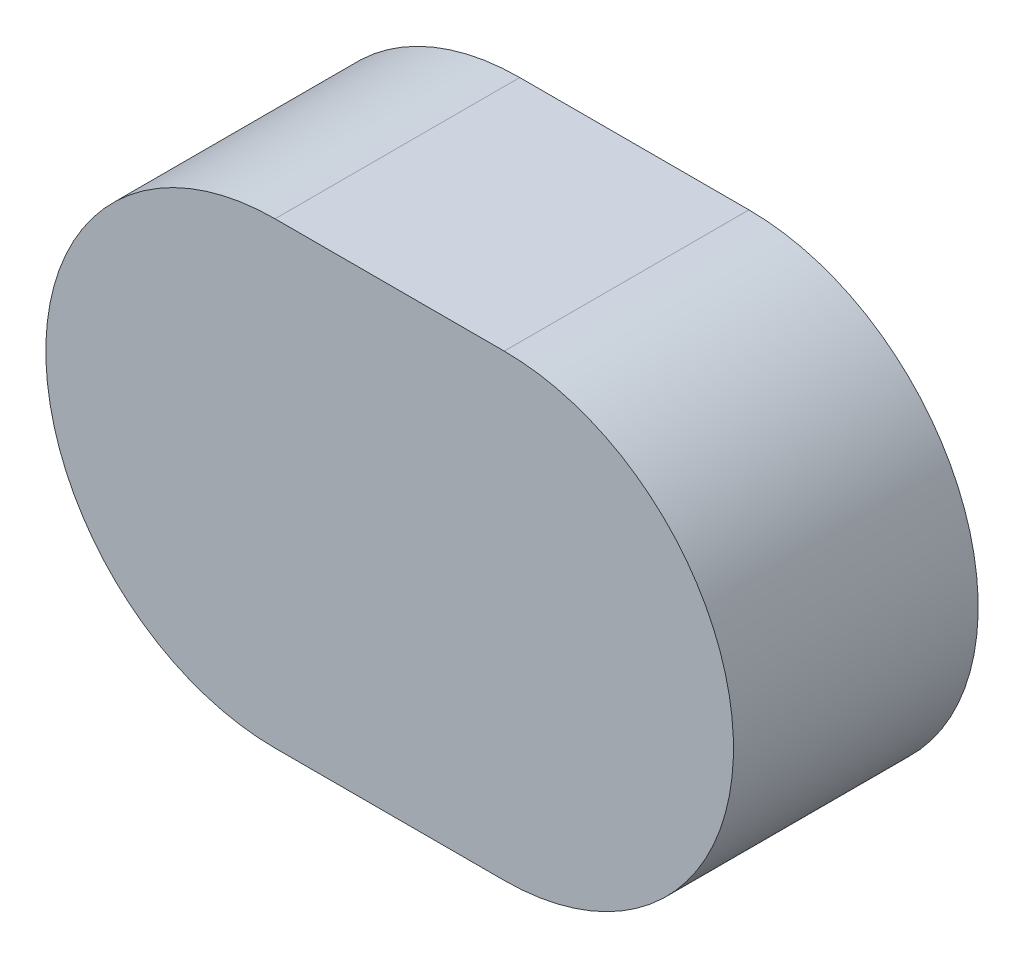
ISO-10303-21;
HEADER;
FILE_DESCRIPTION(('STEP AP214'),'2;1');
FILE_NAME('part.step','',(''),(''),'','','');
FILE_SCHEMA(('AUTOMOTIVE_DESIGN { 1 0 10303 214 1 1 1 1 }'));
ENDSEC;
DATA;
#1=APPLICATION_CONTEXT('core data for automotive mechanical design processes');
#2=APPLICATION_PROTOCOL_DEFINITION('international standard','automotive_design',2000,#1);
#3=PRODUCT_CONTEXT('',#1,'mechanical');
#4=PRODUCT('Part','Part','',(#3));
#5=PRODUCT_RELATED_PRODUCT_CATEGORY('part','',(#4));
#6=PRODUCT_DEFINITION_FORMATION('','',#4);
#7=PRODUCT_DEFINITION_CONTEXT('part definition',#1,'design');
#8=PRODUCT_DEFINITION('design','',#6,#7);
#9=PRODUCT_DEFINITION_SHAPE('','',#8);
#10=(LENGTH_UNIT() NAMED_UNIT(*) SI_UNIT(.MILLI.,.METRE.));
#11=(NAMED_UNIT(*) PLANE_ANGLE_UNIT() SI_UNIT($,.RADIAN.));
#12=(NAMED_UNIT(*) SI_UNIT($,.STERADIAN.) SOLID_ANGLE_UNIT());
#13=UNCERTAINTY_MEASURE_WITH_UNIT(LENGTH_MEASURE(1.E-05),#10,'distance_accuracy_value','');
#14=(GEOMETRIC_REPRESENTATION_CONTEXT(3) GLOBAL_UNCERTAINTY_ASSIGNED_CONTEXT((#13)) GLOBAL_UNIT_ASSIGNED_CONTEXT((#10,
#11,#12)) REPRESENTATION_CONTEXT('',''));
#15=CARTESIAN_POINT('',(0.,0.,0.));
#16=DIRECTION('',(0.,0.,1.));
#17=DIRECTION('',(1.,0.,0.));
#18=AXIS2_PLACEMENT_3D('',#15,#16,#17);
#19=CARTESIAN_POINT('',(-17.8759687907011,0.,4.27));
#20=DIRECTION('',(0.,0.,-1.));
#21=DIRECTION('',(-1.,0.,0.));
#22=AXIS2_PLACEMENT_3D('',#19,#20,#21);
#23=CYLINDRICAL_SURFACE('',#22,4.);
#24=CARTESIAN_POINT('',(-17.8759687907011,0.,0.));
#25=DIRECTION('',(0.,0.,1.));
#26=DIRECTION('',(1.,0.,0.));
#27=AXIS2_PLACEMENT_3D('',#24,#25,#26);
#28=CIRCLE('',#27,4.);
#29=CARTESIAN_POINT('',(-17.8759687907011,4.,0.));
#30=VERTEX_POINT('',#29);
#31=CARTESIAN_POINT('',(-17.8759687907011,-4.,0.));
#32=VERTEX_POINT('',#31);
#33=EDGE_CURVE('E99',#30,#32,#28,.T.);
#34=ORIENTED_EDGE('',*,*,#33,.T.);
#35=DIRECTION('',(0.,0.,-1.));
#36=VECTOR('',#35,1.);
#37=CARTESIAN_POINT('',(-17.8759687907011,-4.,4.27));
#38=LINE('',#37,#36);
#39=CARTESIAN_POINT('',(-17.8759687907011,-4.,4.27));
#40=VERTEX_POINT('',#39);
#41=EDGE_CURVE('E11',#40,#32,#38,.T.);
#42=ORIENTED_EDGE('',*,*,#41,.F.);
#43=CARTESIAN_POINT('',(-17.8759687907011,0.,4.27));
#44=DIRECTION('',(0.,0.,1.));
#45=DIRECTION('',(1.,0.,0.));
#46=AXIS2_PLACEMENT_3D('',#43,#44,#45);
#47=CIRCLE('',#46,4.);
#48=CARTESIAN_POINT('',(-17.8759687907011,4.,4.27));
#49=VERTEX_POINT('',#48);
#50=EDGE_CURVE('E87',#49,#40,#47,.T.);
#51=ORIENTED_EDGE('',*,*,#50,.F.);
#52=DIRECTION('',(0.,0.,-1.));
#53=VECTOR('',#52,1.);
#54=CARTESIAN_POINT('',(-17.8759687907011,4.,4.27));
#55=LINE('',#54,#53);
#56=EDGE_CURVE('E95',#49,#30,#55,.T.);
#57=ORIENTED_EDGE('',*,*,#56,.T.);
#58=EDGE_LOOP('',(#34,#42,#51,#57));
#59=FACE_BOUND('',#58,.T.);
#60=ADVANCED_FACE('F36',(#59),#23,.T.);
#61=CARTESIAN_POINT('',(-17.8759687907011,-4.,4.27));
#62=DIRECTION('',(0.,1.,0.));
#63=DIRECTION('',(0.,0.,1.));
#64=AXIS2_PLACEMENT_3D('',#61,#62,#63);
#65=PLANE('',#64);
#66=DIRECTION('',(1.,0.,0.));
#67=VECTOR('',#66,1.);
#68=CARTESIAN_POINT('',(-17.8759687907011,-4.,0.));
#69=LINE('',#68,#67);
#70=CARTESIAN_POINT('',(-13.8759687907011,-4.,0.));
#71=VERTEX_POINT('',#70);
#72=EDGE_CURVE('E91',#32,#71,#69,.T.);
#73=ORIENTED_EDGE('',*,*,#72,.T.);
#74=DIRECTION('',(0.,0.,-1.));
#75=VECTOR('',#74,1.);
#76=CARTESIAN_POINT('',(-13.8759687907011,-4.,4.27));
#77=LINE('',#76,#75);
#78=CARTESIAN_POINT('',(-13.8759687907011,-4.,4.27));
#79=VERTEX_POINT('',#78);
#80=EDGE_CURVE('E44',#79,#71,#77,.T.);
#81=ORIENTED_EDGE('',*,*,#80,.F.);
#82=DIRECTION('',(1.,0.,0.));
#83=VECTOR('',#82,1.);
#84=CARTESIAN_POINT('',(-17.8759687907011,-4.,4.27));
#85=LINE('',#84,#83);
#86=EDGE_CURVE('E82',#40,#79,#85,.T.);
#87=ORIENTED_EDGE('',*,*,#86,.F.);
#88=ORIENTED_EDGE('',*,*,#41,.T.);
#89=EDGE_LOOP('',(#73,#81,#87,#88));
#90=FACE_BOUND('',#89,.T.);
#91=ADVANCED_FACE('F90',(#90),#65,.F.);
#92=CARTESIAN_POINT('',(-13.8759687907011,0.,4.27));
#93=DIRECTION('',(0.,0.,-1.));
#94=DIRECTION('',(-1.,0.,0.));
#95=AXIS2_PLACEMENT_3D('',#92,#93,#94);
#96=CYLINDRICAL_SURFACE('',#95,4.);
#97=CARTESIAN_POINT('',(-13.8759687907011,0.,0.));
#98=DIRECTION('',(0.,0.,1.));
#99=DIRECTION('',(1.,0.,0.));
#100=AXIS2_PLACEMENT_3D('',#97,#98,#99);
#101=CIRCLE('',#100,4.);
#102=CARTESIAN_POINT('',(-13.8759687907011,4.,0.));
#103=VERTEX_POINT('',#102);
#104=EDGE_CURVE('E69',#71,#103,#101,.T.);
#105=ORIENTED_EDGE('',*,*,#104,.T.);
#106=DIRECTION('',(0.,0.,-1.));
#107=VECTOR('',#106,1.);
#108=CARTESIAN_POINT('',(-13.8759687907011,4.,4.27));
#109=LINE('',#108,#107);
#110=CARTESIAN_POINT('',(-13.8759687907011,4.,4.27));
#111=VERTEX_POINT('',#110);
#112=EDGE_CURVE('E92',#111,#103,#109,.T.);
#113=ORIENTED_EDGE('',*,*,#112,.F.);
#114=CARTESIAN_POINT('',(-13.8759687907011,0.,4.27));
#115=DIRECTION('',(0.,0.,1.));
#116=DIRECTION('',(1.,0.,0.));
#117=AXIS2_PLACEMENT_3D('',#114,#115,#116);
#118=CIRCLE('',#117,4.);
#119=EDGE_CURVE('E85',#79,#111,#118,.T.);
#120=ORIENTED_EDGE('',*,*,#119,.F.);
#121=ORIENTED_EDGE('',*,*,#80,.T.);
#122=EDGE_LOOP('',(#105,#113,#120,#121));
#123=FACE_BOUND('',#122,.T.);
#124=ADVANCED_FACE('F93',(#123),#96,.T.);
#125=CARTESIAN_POINT('',(-17.8759687907011,4.,4.27));
#126=DIRECTION('',(0.,-1.,0.));
#127=DIRECTION('',(0.,0.,-1.));
#128=AXIS2_PLACEMENT_3D('',#125,#126,#127);
#129=PLANE('',#128);
#130=DIRECTION('',(-1.,0.,0.));
#131=VECTOR('',#130,1.);
#132=CARTESIAN_POINT('',(-17.8759687907011,4.,0.));
#133=LINE('',#132,#131);
#134=EDGE_CURVE('E75',#103,#30,#133,.T.);
#135=ORIENTED_EDGE('',*,*,#134,.T.);
#136=ORIENTED_EDGE('',*,*,#56,.F.);
#137=DIRECTION('',(-1.,0.,0.));
#138=VECTOR('',#137,1.);
#139=CARTESIAN_POINT('',(-17.8759687907011,4.,4.27));
#140=LINE('',#139,#138);
#141=EDGE_CURVE('E52',#111,#49,#140,.T.);
#142=ORIENTED_EDGE('',*,*,#141,.F.);
#143=ORIENTED_EDGE('',*,*,#112,.T.);
#144=EDGE_LOOP('',(#135,#136,#142,#143));
#145=FACE_BOUND('',#144,.T.);
#146=ADVANCED_FACE('F106',(#145),#129,.F.);
#147=CARTESIAN_POINT('',(-17.8759687907011,0.,4.27));
#148=DIRECTION('',(0.,0.,1.));
#149=DIRECTION('',(1.,0.,0.));
#150=AXIS2_PLACEMENT_3D('',#147,#148,#149);
#151=PLANE('',#150);
#152=ORIENTED_EDGE('',*,*,#50,.T.);
#153=ORIENTED_EDGE('',*,*,#86,.T.);
#154=ORIENTED_EDGE('',*,*,#119,.T.);
#155=ORIENTED_EDGE('',*,*,#141,.T.);
#156=EDGE_LOOP('',(#152,#153,#154,#155));
#157=FACE_BOUND('',#156,.T.);
#158=ADVANCED_FACE('F83',(#157),#151,.T.);
#159=CARTESIAN_POINT('',(-17.8759687907011,0.,0.));
#160=DIRECTION('',(0.,0.,1.));
#161=DIRECTION('',(1.,0.,0.));
#162=AXIS2_PLACEMENT_3D('',#159,#160,#161);
#163=PLANE('',#162);
#164=ORIENTED_EDGE('',*,*,#33,.F.);
#165=ORIENTED_EDGE('',*,*,#134,.F.);
#166=ORIENTED_EDGE('',*,*,#104,.F.);
#167=ORIENTED_EDGE('',*,*,#72,.F.);
#168=EDGE_LOOP('',(#164,#165,#166,#167));
#169=FACE_BOUND('',#168,.T.);
#170=ADVANCED_FACE('F109',(#169),#163,.F.);
#171=CLOSED_SHELL('',(#60,#91,#124,#146,#158,#170));
#172=MANIFOLD_SOLID_BREP('B2',#171);
#173=ADVANCED_BREP_SHAPE_REPRESENTATION('',(#18,#172),#14);
#174=SHAPE_DEFINITION_REPRESENTATION(#9,#173);
ENDSEC;
END-ISO-10303-21;
